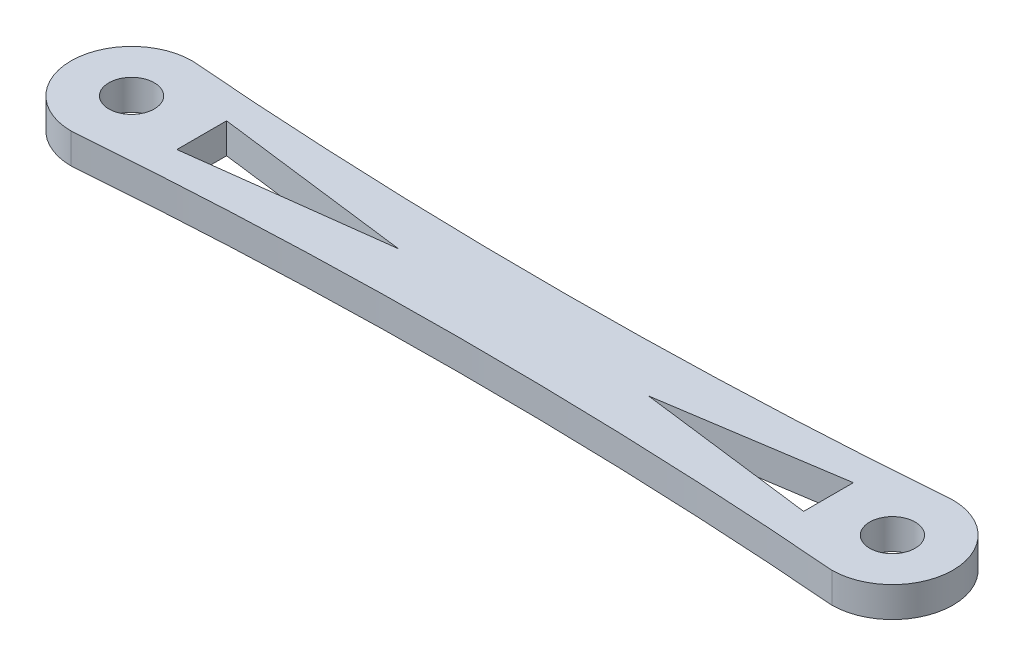
ISO-10303-21;
HEADER;
FILE_DESCRIPTION(('STEP AP214'),'2;1');
FILE_NAME('part.step','',(''),(''),'','','');
FILE_SCHEMA(('AUTOMOTIVE_DESIGN { 1 0 10303 214 1 1 1 1 }'));
ENDSEC;
DATA;
#1=APPLICATION_CONTEXT('core data for automotive mechanical design processes');
#2=APPLICATION_PROTOCOL_DEFINITION('international standard','automotive_design',2000,#1);
#3=PRODUCT_CONTEXT('',#1,'mechanical');
#4=PRODUCT('Part','Part','',(#3));
#5=PRODUCT_RELATED_PRODUCT_CATEGORY('part','',(#4));
#6=PRODUCT_DEFINITION_FORMATION('','',#4);
#7=PRODUCT_DEFINITION_CONTEXT('part definition',#1,'design');
#8=PRODUCT_DEFINITION('design','',#6,#7);
#9=PRODUCT_DEFINITION_SHAPE('','',#8);
#10=(LENGTH_UNIT() NAMED_UNIT(*) SI_UNIT(.MILLI.,.METRE.));
#11=(NAMED_UNIT(*) PLANE_ANGLE_UNIT() SI_UNIT($,.RADIAN.));
#12=(NAMED_UNIT(*) SI_UNIT($,.STERADIAN.) SOLID_ANGLE_UNIT());
#13=UNCERTAINTY_MEASURE_WITH_UNIT(LENGTH_MEASURE(1.E-05),#10,'distance_accuracy_value','');
#14=(GEOMETRIC_REPRESENTATION_CONTEXT(3) GLOBAL_UNCERTAINTY_ASSIGNED_CONTEXT((#13)) GLOBAL_UNIT_ASSIGNED_CONTEXT((#10,
#11,#12)) REPRESENTATION_CONTEXT('',''));
#15=CARTESIAN_POINT('',(0.,0.,0.));
#16=DIRECTION('',(0.,0.,1.));
#17=DIRECTION('',(1.,0.,0.));
#18=AXIS2_PLACEMENT_3D('',#15,#16,#17);
#19=CARTESIAN_POINT('',(251.,10.,0.));
#20=CARTESIAN_POINT('',(125.5,10.,10.));
#21=CARTESIAN_POINT('',(0.,10.,0.));
#22=B_SPLINE_CURVE_WITH_KNOTS('',2,(#19,#20,#21),.UNSPECIFIED.,.F.,.F.,(3,3),(0.,1.),.UNSPECIFIED.);
#23=DIRECTION('',(0.,-1.,0.));
#24=VECTOR('',#23,1.);
#25=SURFACE_OF_LINEAR_EXTRUSION('',#22,#24);
#26=CARTESIAN_POINT('',(251.,0.,0.));
#27=CARTESIAN_POINT('',(125.5,0.,10.));
#28=CARTESIAN_POINT('',(0.,0.,0.));
#29=B_SPLINE_CURVE_WITH_KNOTS('',2,(#26,#27,#28),.UNSPECIFIED.,.F.,.F.,(3,3),(0.,1.),.UNSPECIFIED.);
#30=CARTESIAN_POINT('',(251.,0.,0.));
#31=VERTEX_POINT('',#30);
#32=CARTESIAN_POINT('',(0.,0.,0.));
#33=VERTEX_POINT('',#32);
#34=EDGE_CURVE('E176',#31,#33,#29,.T.);
#35=ORIENTED_EDGE('',*,*,#34,.T.);
#36=DIRECTION('',(0.,-1.,0.));
#37=VECTOR('',#36,1.);
#38=CARTESIAN_POINT('',(0.,10.,0.));
#39=LINE('',#38,#37);
#40=CARTESIAN_POINT('',(0.,10.,0.));
#41=VERTEX_POINT('',#40);
#42=EDGE_CURVE('E11',#41,#33,#39,.T.);
#43=ORIENTED_EDGE('',*,*,#42,.F.);
#44=CARTESIAN_POINT('',(251.,10.,0.));
#45=VERTEX_POINT('',#44);
#46=EDGE_CURVE('E178',#45,#41,#22,.T.);
#47=ORIENTED_EDGE('',*,*,#46,.F.);
#48=DIRECTION('',(0.,-1.,0.));
#49=VECTOR('',#48,1.);
#50=CARTESIAN_POINT('',(251.,10.,0.));
#51=LINE('',#50,#49);
#52=EDGE_CURVE('E237',#45,#31,#51,.T.);
#53=ORIENTED_EDGE('',*,*,#52,.T.);
#54=EDGE_LOOP('',(#35,#43,#47,#53));
#55=FACE_BOUND('',#54,.T.);
#56=ADVANCED_FACE('F37',(#55),#25,.F.);
#57=CARTESIAN_POINT('',(0.,10.,20.));
#58=DIRECTION('',(0.,-1.,0.));
#59=DIRECTION('',(0.,0.,-1.));
#60=AXIS2_PLACEMENT_3D('',#57,#58,#59);
#61=CYLINDRICAL_SURFACE('',#60,20.);
#62=CARTESIAN_POINT('',(0.,0.,20.));
#63=DIRECTION('',(0.,1.,0.));
#64=DIRECTION('',(0.,0.,1.));
#65=AXIS2_PLACEMENT_3D('',#62,#63,#64);
#66=CIRCLE('',#65,20.);
#67=CARTESIAN_POINT('',(0.,0.,40.));
#68=VERTEX_POINT('',#67);
#69=EDGE_CURVE('E215',#33,#68,#66,.T.);
#70=ORIENTED_EDGE('',*,*,#69,.T.);
#71=DIRECTION('',(0.,-1.,0.));
#72=VECTOR('',#71,1.);
#73=CARTESIAN_POINT('',(0.,10.,40.));
#74=LINE('',#73,#72);
#75=CARTESIAN_POINT('',(0.,10.,40.));
#76=VERTEX_POINT('',#75);
#77=EDGE_CURVE('E45',#76,#68,#74,.T.);
#78=ORIENTED_EDGE('',*,*,#77,.F.);
#79=CARTESIAN_POINT('',(0.,10.,20.));
#80=DIRECTION('',(0.,1.,0.));
#81=DIRECTION('',(0.,0.,1.));
#82=AXIS2_PLACEMENT_3D('',#79,#80,#81);
#83=CIRCLE('',#82,20.);
#84=EDGE_CURVE('E184',#41,#76,#83,.T.);
#85=ORIENTED_EDGE('',*,*,#84,.F.);
#86=ORIENTED_EDGE('',*,*,#42,.T.);
#87=EDGE_LOOP('',(#70,#78,#85,#86));
#88=FACE_BOUND('',#87,.T.);
#89=ADVANCED_FACE('F205',(#88),#61,.T.);
#90=CARTESIAN_POINT('',(0.,10.,40.));
#91=CARTESIAN_POINT('',(125.5,10.,30.));
#92=CARTESIAN_POINT('',(251.,10.,40.));
#93=B_SPLINE_CURVE_WITH_KNOTS('',2,(#90,#91,#92),.UNSPECIFIED.,.F.,.F.,(3,3),(0.,1.),.UNSPECIFIED.);
#94=DIRECTION('',(0.,-1.,0.));
#95=VECTOR('',#94,1.);
#96=SURFACE_OF_LINEAR_EXTRUSION('',#93,#95);
#97=CARTESIAN_POINT('',(0.,0.,40.));
#98=CARTESIAN_POINT('',(125.5,0.,30.));
#99=CARTESIAN_POINT('',(251.,0.,40.));
#100=B_SPLINE_CURVE_WITH_KNOTS('',2,(#97,#98,#99),.UNSPECIFIED.,.F.,.F.,(3,3),(0.,1.),.UNSPECIFIED.);
#101=CARTESIAN_POINT('',(251.,0.,40.));
#102=VERTEX_POINT('',#101);
#103=EDGE_CURVE('E223',#68,#102,#100,.T.);
#104=ORIENTED_EDGE('',*,*,#103,.T.);
#105=DIRECTION('',(0.,-1.,0.));
#106=VECTOR('',#105,1.);
#107=CARTESIAN_POINT('',(251.,10.,40.));
#108=LINE('',#107,#106);
#109=CARTESIAN_POINT('',(251.,10.,40.));
#110=VERTEX_POINT('',#109);
#111=EDGE_CURVE('E227',#110,#102,#108,.T.);
#112=ORIENTED_EDGE('',*,*,#111,.F.);
#113=EDGE_CURVE('E190',#76,#110,#93,.T.);
#114=ORIENTED_EDGE('',*,*,#113,.F.);
#115=ORIENTED_EDGE('',*,*,#77,.T.);
#116=EDGE_LOOP('',(#104,#112,#114,#115));
#117=FACE_BOUND('',#116,.T.);
#118=ADVANCED_FACE('F201',(#117),#96,.F.);
#119=CARTESIAN_POINT('',(251.,10.,20.));
#120=DIRECTION('',(0.,-1.,0.));
#121=DIRECTION('',(0.,0.,-1.));
#122=AXIS2_PLACEMENT_3D('',#119,#120,#121);
#123=CYLINDRICAL_SURFACE('',#122,20.);
#124=CARTESIAN_POINT('',(251.,0.,20.));
#125=DIRECTION('',(0.,1.,0.));
#126=DIRECTION('',(0.,0.,-1.));
#127=AXIS2_PLACEMENT_3D('',#124,#125,#126);
#128=CIRCLE('',#127,20.);
#129=EDGE_CURVE('E185',#102,#31,#128,.T.);
#130=ORIENTED_EDGE('',*,*,#129,.T.);
#131=ORIENTED_EDGE('',*,*,#52,.F.);
#132=CARTESIAN_POINT('',(251.,10.,20.));
#133=DIRECTION('',(0.,1.,0.));
#134=DIRECTION('',(0.,0.,-1.));
#135=AXIS2_PLACEMENT_3D('',#132,#133,#134);
#136=CIRCLE('',#135,20.);
#137=EDGE_CURVE('E195',#110,#45,#136,.T.);
#138=ORIENTED_EDGE('',*,*,#137,.F.);
#139=ORIENTED_EDGE('',*,*,#111,.T.);
#140=EDGE_LOOP('',(#130,#131,#138,#139));
#141=FACE_BOUND('',#140,.T.);
#142=ADVANCED_FACE('F204',(#141),#123,.T.);
#143=CARTESIAN_POINT('',(125.5,10.,5.));
#144=DIRECTION('',(0.,-1.,0.));
#145=DIRECTION('',(0.,0.,-1.));
#146=AXIS2_PLACEMENT_3D('',#143,#144,#145);
#147=PLANE('',#146);
#148=DIRECTION('',(0.,0.,1.));
#149=VECTOR('',#148,1.);
#150=CARTESIAN_POINT('',(22.7999178969701,10.,11.4558999914284));
#151=LINE('',#150,#149);
#152=CARTESIAN_POINT('',(22.7999178969701,10.,11.4558999914284));
#153=VERTEX_POINT('',#152);
#154=CARTESIAN_POINT('',(22.7999178969701,10.,27.8605720078858));
#155=VERTEX_POINT('',#154);
#156=EDGE_CURVE('E135',#153,#155,#151,.T.);
#157=ORIENTED_EDGE('',*,*,#156,.F.);
#158=DIRECTION('',(-0.992116377624626,0.,-0.125319963489426));
#159=VECTOR('',#158,1.);
#160=CARTESIAN_POINT('',(87.7350779621138,10.,19.6582359996571));
#161=LINE('',#160,#159);
#162=CARTESIAN_POINT('',(87.7350779621138,10.,19.6582359996571));
#163=VERTEX_POINT('',#162);
#164=EDGE_CURVE('E52',#163,#153,#161,.T.);
#165=ORIENTED_EDGE('',*,*,#164,.F.);
#166=DIRECTION('',(0.992116377624626,0.,-0.125319963489426));
#167=VECTOR('',#166,1.);
#168=CARTESIAN_POINT('',(22.7999178969701,10.,27.8605720078858));
#169=LINE('',#168,#167);
#170=EDGE_CURVE('E132',#155,#163,#169,.T.);
#171=ORIENTED_EDGE('',*,*,#170,.F.);
#172=EDGE_LOOP('',(#157,#165,#171));
#173=FACE_BOUND('',#172,.T.);
#174=DIRECTION('',(0.992116377624626,0.,0.125319963489426));
#175=VECTOR('',#174,1.);
#176=CARTESIAN_POINT('',(229.567138104401,10.,27.8605720078858));
#177=LINE('',#176,#175);
#178=CARTESIAN_POINT('',(170.984561590183,10.,20.4606676060898));
#179=VERTEX_POINT('',#178);
#180=CARTESIAN_POINT('',(229.567138104401,10.,27.8605720078858));
#181=VERTEX_POINT('',#180);
#182=EDGE_CURVE('E155',#179,#181,#177,.T.);
#183=ORIENTED_EDGE('',*,*,#182,.F.);
#184=DIRECTION('',(-0.988391813026454,0.,0.151926376716751));
#185=VECTOR('',#184,1.);
#186=CARTESIAN_POINT('',(170.984561590183,10.,20.4606676060898));
#187=LINE('',#186,#185);
#188=CARTESIAN_POINT('',(229.567138104401,10.,11.4558999914284));
#189=VERTEX_POINT('',#188);
#190=EDGE_CURVE('E60',#189,#179,#187,.T.);
#191=ORIENTED_EDGE('',*,*,#190,.F.);
#192=DIRECTION('',(0.,0.,-1.));
#193=VECTOR('',#192,1.);
#194=CARTESIAN_POINT('',(229.567138104401,10.,11.4558999914284));
#195=LINE('',#194,#193);
#196=EDGE_CURVE('E152',#181,#189,#195,.T.);
#197=ORIENTED_EDGE('',*,*,#196,.F.);
#198=EDGE_LOOP('',(#183,#191,#197));
#199=FACE_BOUND('',#198,.T.);
#200=CARTESIAN_POINT('',(251.,10.,20.));
#201=DIRECTION('',(0.,1.,0.));
#202=DIRECTION('',(0.,0.,1.));
#203=AXIS2_PLACEMENT_3D('',#200,#201,#202);
#204=CIRCLE('',#203,7.50000000000001);
#205=CARTESIAN_POINT('',(251.,10.,27.5));
#206=VERTEX_POINT('',#205);
#207=EDGE_CURVE('E143',#206,#206,#204,.T.);
#208=ORIENTED_EDGE('',*,*,#207,.F.);
#209=EDGE_LOOP('',(#208));
#210=FACE_BOUND('',#209,.T.);
#211=CARTESIAN_POINT('',(0.,10.,20.));
#212=DIRECTION('',(0.,1.,0.));
#213=DIRECTION('',(0.,0.,1.));
#214=AXIS2_PLACEMENT_3D('',#211,#212,#213);
#215=CIRCLE('',#214,7.5);
#216=CARTESIAN_POINT('',(0.,10.,27.5));
#217=VERTEX_POINT('',#216);
#218=EDGE_CURVE('E170',#217,#217,#215,.T.);
#219=ORIENTED_EDGE('',*,*,#218,.F.);
#220=EDGE_LOOP('',(#219));
#221=FACE_BOUND('',#220,.T.);
#222=ORIENTED_EDGE('',*,*,#46,.T.);
#223=ORIENTED_EDGE('',*,*,#84,.T.);
#224=ORIENTED_EDGE('',*,*,#113,.T.);
#225=ORIENTED_EDGE('',*,*,#137,.T.);
#226=EDGE_LOOP('',(#222,#223,#224,#225));
#227=FACE_BOUND('',#226,.T.);
#228=ADVANCED_FACE('F245',(#173,#199,#210,#221,#227),#147,.F.);
#229=CARTESIAN_POINT('',(125.5,0.,5.));
#230=DIRECTION('',(0.,-1.,0.));
#231=DIRECTION('',(0.,0.,-1.));
#232=AXIS2_PLACEMENT_3D('',#229,#230,#231);
#233=PLANE('',#232);
#234=DIRECTION('',(-0.992116377624626,0.,-0.125319963489426));
#235=VECTOR('',#234,1.);
#236=CARTESIAN_POINT('',(87.7350779621138,0.,19.6582359996571));
#237=LINE('',#236,#235);
#238=CARTESIAN_POINT('',(87.7350779621138,0.,19.6582359996571));
#239=VERTEX_POINT('',#238);
#240=CARTESIAN_POINT('',(22.7999178969701,0.,11.4558999914284));
#241=VERTEX_POINT('',#240);
#242=EDGE_CURVE('E116',#239,#241,#237,.T.);
#243=ORIENTED_EDGE('',*,*,#242,.T.);
#244=DIRECTION('',(0.,0.,1.));
#245=VECTOR('',#244,1.);
#246=CARTESIAN_POINT('',(22.7999178969701,0.,11.4558999914284));
#247=LINE('',#246,#245);
#248=CARTESIAN_POINT('',(22.7999178969701,0.,27.8605720078858));
#249=VERTEX_POINT('',#248);
#250=EDGE_CURVE('E126',#241,#249,#247,.T.);
#251=ORIENTED_EDGE('',*,*,#250,.T.);
#252=DIRECTION('',(0.992116377624626,0.,-0.125319963489426));
#253=VECTOR('',#252,1.);
#254=CARTESIAN_POINT('',(22.7999178969701,0.,27.8605720078858));
#255=LINE('',#254,#253);
#256=EDGE_CURVE('E122',#249,#239,#255,.T.);
#257=ORIENTED_EDGE('',*,*,#256,.T.);
#258=EDGE_LOOP('',(#243,#251,#257));
#259=FACE_BOUND('',#258,.T.);
#260=DIRECTION('',(-0.988391813026454,0.,0.151926376716751));
#261=VECTOR('',#260,1.);
#262=CARTESIAN_POINT('',(170.984561590183,0.,20.4606676060898));
#263=LINE('',#262,#261);
#264=CARTESIAN_POINT('',(229.567138104401,0.,11.4558999914284));
#265=VERTEX_POINT('',#264);
#266=CARTESIAN_POINT('',(170.984561590183,0.,20.4606676060898));
#267=VERTEX_POINT('',#266);
#268=EDGE_CURVE('E156',#265,#267,#263,.T.);
#269=ORIENTED_EDGE('',*,*,#268,.T.);
#270=DIRECTION('',(0.992116377624626,0.,0.125319963489426));
#271=VECTOR('',#270,1.);
#272=CARTESIAN_POINT('',(229.567138104401,0.,27.8605720078858));
#273=LINE('',#272,#271);
#274=CARTESIAN_POINT('',(229.567138104401,0.,27.8605720078858));
#275=VERTEX_POINT('',#274);
#276=EDGE_CURVE('E162',#267,#275,#273,.T.);
#277=ORIENTED_EDGE('',*,*,#276,.T.);
#278=DIRECTION('',(0.,0.,-1.));
#279=VECTOR('',#278,1.);
#280=CARTESIAN_POINT('',(229.567138104401,0.,11.4558999914284));
#281=LINE('',#280,#279);
#282=EDGE_CURVE('E147',#275,#265,#281,.T.);
#283=ORIENTED_EDGE('',*,*,#282,.T.);
#284=EDGE_LOOP('',(#269,#277,#283));
#285=FACE_BOUND('',#284,.T.);
#286=CARTESIAN_POINT('',(251.,0.,20.));
#287=DIRECTION('',(0.,1.,0.));
#288=DIRECTION('',(0.,0.,1.));
#289=AXIS2_PLACEMENT_3D('',#286,#287,#288);
#290=CIRCLE('',#289,7.50000000000001);
#291=CARTESIAN_POINT('',(251.,0.,27.5));
#292=VERTEX_POINT('',#291);
#293=EDGE_CURVE('E167',#292,#292,#290,.T.);
#294=ORIENTED_EDGE('',*,*,#293,.T.);
#295=EDGE_LOOP('',(#294));
#296=FACE_BOUND('',#295,.T.);
#297=CARTESIAN_POINT('',(0.,0.,20.));
#298=DIRECTION('',(0.,1.,0.));
#299=DIRECTION('',(0.,0.,1.));
#300=AXIS2_PLACEMENT_3D('',#297,#298,#299);
#301=CIRCLE('',#300,7.5);
#302=CARTESIAN_POINT('',(0.,0.,27.5));
#303=VERTEX_POINT('',#302);
#304=EDGE_CURVE('E173',#303,#303,#301,.T.);
#305=ORIENTED_EDGE('',*,*,#304,.T.);
#306=EDGE_LOOP('',(#305));
#307=FACE_BOUND('',#306,.T.);
#308=ORIENTED_EDGE('',*,*,#34,.F.);
#309=ORIENTED_EDGE('',*,*,#129,.F.);
#310=ORIENTED_EDGE('',*,*,#103,.F.);
#311=ORIENTED_EDGE('',*,*,#69,.F.);
#312=EDGE_LOOP('',(#308,#309,#310,#311));
#313=FACE_BOUND('',#312,.T.);
#314=ADVANCED_FACE('F130',(#259,#285,#296,#307,#313),#233,.T.);
#315=CARTESIAN_POINT('',(0.,0.,20.));
#316=DIRECTION('',(0.,1.,0.));
#317=DIRECTION('',(0.,0.,1.));
#318=AXIS2_PLACEMENT_3D('',#315,#316,#317);
#319=CYLINDRICAL_SURFACE('',#318,7.5);
#320=ORIENTED_EDGE('',*,*,#304,.F.);
#321=EDGE_LOOP('',(#320));
#322=FACE_BOUND('',#321,.T.);
#323=ORIENTED_EDGE('',*,*,#218,.T.);
#324=EDGE_LOOP('',(#323));
#325=FACE_BOUND('',#324,.T.);
#326=ADVANCED_FACE('F258',(#322,#325),#319,.F.);
#327=CARTESIAN_POINT('',(251.,0.,20.));
#328=DIRECTION('',(0.,1.,0.));
#329=DIRECTION('',(0.,0.,1.));
#330=AXIS2_PLACEMENT_3D('',#327,#328,#329);
#331=CYLINDRICAL_SURFACE('',#330,7.50000000000001);
#332=ORIENTED_EDGE('',*,*,#293,.F.);
#333=EDGE_LOOP('',(#332));
#334=FACE_BOUND('',#333,.T.);
#335=ORIENTED_EDGE('',*,*,#207,.T.);
#336=EDGE_LOOP('',(#335));
#337=FACE_BOUND('',#336,.T.);
#338=ADVANCED_FACE('F264',(#334,#337),#331,.F.);
#339=CARTESIAN_POINT('',(170.984561590183,0.,20.4606676060898));
#340=DIRECTION('',(-0.151926376716751,0.,-0.988391813026454));
#341=DIRECTION('',(-0.988391813026454,0.,0.151926376716751));
#342=AXIS2_PLACEMENT_3D('',#339,#340,#341);
#343=PLANE('',#342);
#344=ORIENTED_EDGE('',*,*,#190,.T.);
#345=DIRECTION('',(0.,1.,0.));
#346=VECTOR('',#345,1.);
#347=CARTESIAN_POINT('',(170.984561590183,0.,20.4606676060898));
#348=LINE('',#347,#346);
#349=EDGE_CURVE('E145',#267,#179,#348,.T.);
#350=ORIENTED_EDGE('',*,*,#349,.F.);
#351=ORIENTED_EDGE('',*,*,#268,.F.);
#352=DIRECTION('',(0.,1.,0.));
#353=VECTOR('',#352,1.);
#354=CARTESIAN_POINT('',(229.567138104401,0.,11.4558999914284));
#355=LINE('',#354,#353);
#356=EDGE_CURVE('E150',#265,#189,#355,.T.);
#357=ORIENTED_EDGE('',*,*,#356,.T.);
#358=EDGE_LOOP('',(#344,#350,#351,#357));
#359=FACE_BOUND('',#358,.T.);
#360=ADVANCED_FACE('F268',(#359),#343,.F.);
#361=CARTESIAN_POINT('',(229.567138104401,0.,11.4558999914284));
#362=DIRECTION('',(1.,0.,0.));
#363=DIRECTION('',(0.,0.,-1.));
#364=AXIS2_PLACEMENT_3D('',#361,#362,#363);
#365=PLANE('',#364);
#366=ORIENTED_EDGE('',*,*,#196,.T.);
#367=ORIENTED_EDGE('',*,*,#356,.F.);
#368=ORIENTED_EDGE('',*,*,#282,.F.);
#369=DIRECTION('',(0.,1.,0.));
#370=VECTOR('',#369,1.);
#371=CARTESIAN_POINT('',(229.567138104401,0.,27.8605720078858));
#372=LINE('',#371,#370);
#373=EDGE_CURVE('E148',#275,#181,#372,.T.);
#374=ORIENTED_EDGE('',*,*,#373,.T.);
#375=EDGE_LOOP('',(#366,#367,#368,#374));
#376=FACE_BOUND('',#375,.T.);
#377=ADVANCED_FACE('F270',(#376),#365,.F.);
#378=CARTESIAN_POINT('',(229.567138104401,0.,27.8605720078858));
#379=DIRECTION('',(-0.125319963489426,0.,0.992116377624626));
#380=DIRECTION('',(0.992116377624626,0.,0.125319963489426));
#381=AXIS2_PLACEMENT_3D('',#378,#379,#380);
#382=PLANE('',#381);
#383=ORIENTED_EDGE('',*,*,#182,.T.);
#384=ORIENTED_EDGE('',*,*,#373,.F.);
#385=ORIENTED_EDGE('',*,*,#276,.F.);
#386=ORIENTED_EDGE('',*,*,#349,.T.);
#387=EDGE_LOOP('',(#383,#384,#385,#386));
#388=FACE_BOUND('',#387,.T.);
#389=ADVANCED_FACE('F273',(#388),#382,.F.);
#390=CARTESIAN_POINT('',(87.7350779621138,0.,19.6582359996571));
#391=DIRECTION('',(0.125319963489426,0.,-0.992116377624626));
#392=DIRECTION('',(-0.992116377624626,0.,-0.125319963489426));
#393=AXIS2_PLACEMENT_3D('',#390,#391,#392);
#394=PLANE('',#393);
#395=ORIENTED_EDGE('',*,*,#164,.T.);
#396=DIRECTION('',(0.,1.,0.));
#397=VECTOR('',#396,1.);
#398=CARTESIAN_POINT('',(22.7999178969701,0.,11.4558999914284));
#399=LINE('',#398,#397);
#400=EDGE_CURVE('E112',#241,#153,#399,.T.);
#401=ORIENTED_EDGE('',*,*,#400,.F.);
#402=ORIENTED_EDGE('',*,*,#242,.F.);
#403=DIRECTION('',(0.,1.,0.));
#404=VECTOR('',#403,1.);
#405=CARTESIAN_POINT('',(87.7350779621138,0.,19.6582359996571));
#406=LINE('',#405,#404);
#407=EDGE_CURVE('E141',#239,#163,#406,.T.);
#408=ORIENTED_EDGE('',*,*,#407,.T.);
#409=EDGE_LOOP('',(#395,#401,#402,#408));
#410=FACE_BOUND('',#409,.T.);
#411=ADVANCED_FACE('F114',(#410),#394,.F.);
#412=CARTESIAN_POINT('',(22.7999178969701,0.,27.8605720078858));
#413=DIRECTION('',(0.125319963489426,0.,0.992116377624626));
#414=DIRECTION('',(0.992116377624626,0.,-0.125319963489426));
#415=AXIS2_PLACEMENT_3D('',#412,#413,#414);
#416=PLANE('',#415);
#417=ORIENTED_EDGE('',*,*,#170,.T.);
#418=ORIENTED_EDGE('',*,*,#407,.F.);
#419=ORIENTED_EDGE('',*,*,#256,.F.);
#420=DIRECTION('',(0.,1.,0.));
#421=VECTOR('',#420,1.);
#422=CARTESIAN_POINT('',(22.7999178969701,0.,27.8605720078858));
#423=LINE('',#422,#421);
#424=EDGE_CURVE('E121',#249,#155,#423,.T.);
#425=ORIENTED_EDGE('',*,*,#424,.T.);
#426=EDGE_LOOP('',(#417,#418,#419,#425));
#427=FACE_BOUND('',#426,.T.);
#428=ADVANCED_FACE('F282',(#427),#416,.F.);
#429=CARTESIAN_POINT('',(22.7999178969701,0.,11.4558999914284));
#430=DIRECTION('',(-1.,0.,0.));
#431=DIRECTION('',(0.,0.,1.));
#432=AXIS2_PLACEMENT_3D('',#429,#430,#431);
#433=PLANE('',#432);
#434=ORIENTED_EDGE('',*,*,#156,.T.);
#435=ORIENTED_EDGE('',*,*,#424,.F.);
#436=ORIENTED_EDGE('',*,*,#250,.F.);
#437=ORIENTED_EDGE('',*,*,#400,.T.);
#438=EDGE_LOOP('',(#434,#435,#436,#437));
#439=FACE_BOUND('',#438,.T.);
#440=ADVANCED_FACE('F127',(#439),#433,.F.);
#441=CLOSED_SHELL('',(#56,#89,#118,#142,#228,#314,#326,#338,#360,#377,#389,#411,#428,#440));
#442=MANIFOLD_SOLID_BREP('B2',#441);
#443=ADVANCED_BREP_SHAPE_REPRESENTATION('',(#18,#442),#14);
#444=SHAPE_DEFINITION_REPRESENTATION(#9,#443);
ENDSEC;
END-ISO-10303-21;
